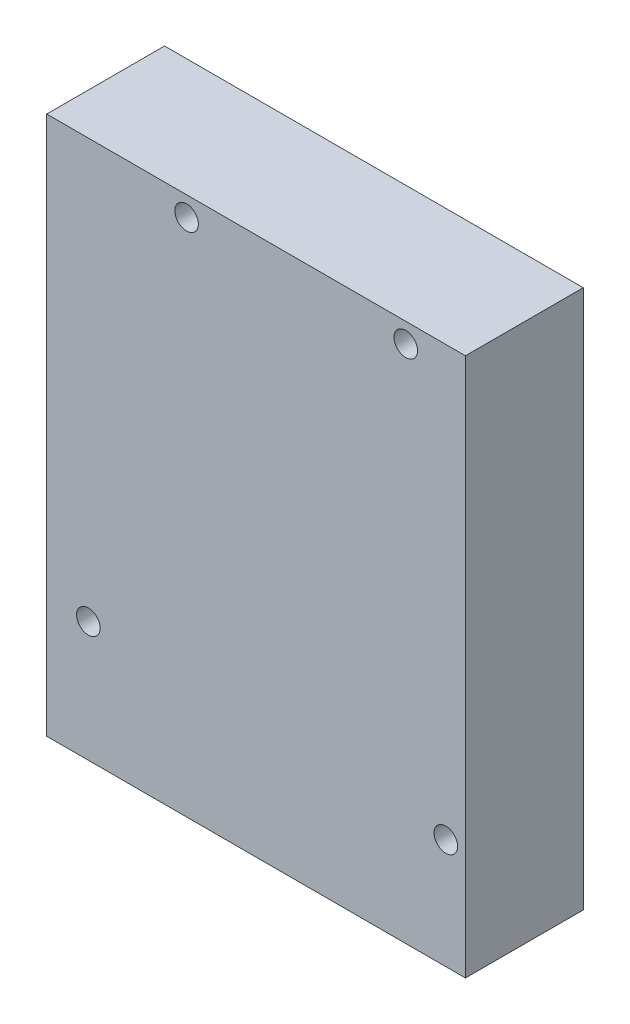
ISO-10303-21;
HEADER;
FILE_DESCRIPTION(('STEP AP214'),'2;1');
FILE_NAME('part.step','',(''),(''),'','','');
FILE_SCHEMA(('AUTOMOTIVE_DESIGN { 1 0 10303 214 1 1 1 1 }'));
ENDSEC;
DATA;
#1=APPLICATION_CONTEXT('core data for automotive mechanical design processes');
#2=APPLICATION_PROTOCOL_DEFINITION('international standard','automotive_design',2000,#1);
#3=PRODUCT_CONTEXT('',#1,'mechanical');
#4=PRODUCT('Part','Part','',(#3));
#5=PRODUCT_RELATED_PRODUCT_CATEGORY('part','',(#4));
#6=PRODUCT_DEFINITION_FORMATION('','',#4);
#7=PRODUCT_DEFINITION_CONTEXT('part definition',#1,'design');
#8=PRODUCT_DEFINITION('design','',#6,#7);
#9=PRODUCT_DEFINITION_SHAPE('','',#8);
#10=(LENGTH_UNIT() NAMED_UNIT(*) SI_UNIT(.MILLI.,.METRE.));
#11=(NAMED_UNIT(*) PLANE_ANGLE_UNIT() SI_UNIT($,.RADIAN.));
#12=(NAMED_UNIT(*) SI_UNIT($,.STERADIAN.) SOLID_ANGLE_UNIT());
#13=UNCERTAINTY_MEASURE_WITH_UNIT(LENGTH_MEASURE(1.E-05),#10,'distance_accuracy_value','');
#14=(GEOMETRIC_REPRESENTATION_CONTEXT(3) GLOBAL_UNCERTAINTY_ASSIGNED_CONTEXT((#13)) GLOBAL_UNIT_ASSIGNED_CONTEXT((#10,
#11,#12)) REPRESENTATION_CONTEXT('',''));
#15=CARTESIAN_POINT('',(0.,0.,0.));
#16=DIRECTION('',(0.,0.,1.));
#17=DIRECTION('',(1.,0.,0.));
#18=AXIS2_PLACEMENT_3D('',#15,#16,#17);
#19=CARTESIAN_POINT('',(0.,0.,15.));
#20=DIRECTION('',(0.,0.,1.));
#21=DIRECTION('',(1.,0.,0.));
#22=AXIS2_PLACEMENT_3D('',#19,#20,#21);
#23=PLANE('',#22);
#24=CARTESIAN_POINT('',(-32.490811044057,0.148070951768275,15.));
#25=DIRECTION('',(0.,0.,1.));
#26=DIRECTION('',(1.,0.,0.));
#27=AXIS2_PLACEMENT_3D('',#24,#25,#26);
#28=CIRCLE('',#27,1.5);
#29=CARTESIAN_POINT('',(-30.990811044057,0.148070951768275,15.));
#30=VERTEX_POINT('',#29);
#31=EDGE_CURVE('E142',#30,#30,#28,.T.);
#32=ORIENTED_EDGE('',*,*,#31,.F.);
#33=EDGE_LOOP('',(#32));
#34=FACE_BOUND('',#33,.T.);
#35=CARTESIAN_POINT('',(-19.990811044057,50.9480709517683,15.));
#36=DIRECTION('',(0.,0.,1.));
#37=DIRECTION('',(1.,0.,0.));
#38=AXIS2_PLACEMENT_3D('',#35,#36,#37);
#39=CIRCLE('',#38,1.5);
#40=CARTESIAN_POINT('',(-18.490811044057,50.9480709517683,15.));
#41=VERTEX_POINT('',#40);
#42=EDGE_CURVE('E112',#41,#41,#39,.T.);
#43=ORIENTED_EDGE('',*,*,#42,.F.);
#44=EDGE_LOOP('',(#43));
#45=FACE_BOUND('',#44,.T.);
#46=DIRECTION('',(0.,-1.,0.));
#47=VECTOR('',#46,1.);
#48=CARTESIAN_POINT('',(-37.790811044057,53.4480709517683,15.));
#49=LINE('',#48,#47);
#50=CARTESIAN_POINT('',(-37.790811044057,53.4480709517683,15.));
#51=VERTEX_POINT('',#50);
#52=CARTESIAN_POINT('',(-37.790811044057,-15.1519290482317,15.));
#53=VERTEX_POINT('',#52);
#54=EDGE_CURVE('E92',#51,#53,#49,.T.);
#55=ORIENTED_EDGE('',*,*,#54,.T.);
#56=DIRECTION('',(1.,0.,0.));
#57=VECTOR('',#56,1.);
#58=CARTESIAN_POINT('',(-37.790811044057,-15.1519290482317,15.));
#59=LINE('',#58,#57);
#60=CARTESIAN_POINT('',(15.509188955943,-15.1519290482317,15.));
#61=VERTEX_POINT('',#60);
#62=EDGE_CURVE('E87',#53,#61,#59,.T.);
#63=ORIENTED_EDGE('',*,*,#62,.T.);
#64=DIRECTION('',(0.,1.,0.));
#65=VECTOR('',#64,1.);
#66=CARTESIAN_POINT('',(15.509188955943,53.4480709517683,15.));
#67=LINE('',#66,#65);
#68=CARTESIAN_POINT('',(15.509188955943,53.4480709517683,15.));
#69=VERTEX_POINT('',#68);
#70=EDGE_CURVE('E90',#61,#69,#67,.T.);
#71=ORIENTED_EDGE('',*,*,#70,.T.);
#72=DIRECTION('',(-1.,0.,0.));
#73=VECTOR('',#72,1.);
#74=CARTESIAN_POINT('',(-37.790811044057,53.4480709517683,15.));
#75=LINE('',#74,#73);
#76=EDGE_CURVE('E57',#69,#51,#75,.T.);
#77=ORIENTED_EDGE('',*,*,#76,.T.);
#78=EDGE_LOOP('',(#55,#63,#71,#77));
#79=FACE_BOUND('',#78,.T.);
#80=CARTESIAN_POINT('',(7.909188955943,50.9480709517683,15.));
#81=DIRECTION('',(0.,0.,1.));
#82=DIRECTION('',(1.,0.,0.));
#83=AXIS2_PLACEMENT_3D('',#80,#81,#82);
#84=CIRCLE('',#83,1.5);
#85=CARTESIAN_POINT('',(9.409188955943,50.9480709517683,15.));
#86=VERTEX_POINT('',#85);
#87=EDGE_CURVE('E134',#86,#86,#84,.T.);
#88=ORIENTED_EDGE('',*,*,#87,.F.);
#89=EDGE_LOOP('',(#88));
#90=FACE_BOUND('',#89,.T.);
#91=CARTESIAN_POINT('',(13.009188955943,-1.15192904823173,15.));
#92=DIRECTION('',(0.,0.,1.));
#93=DIRECTION('',(1.,0.,0.));
#94=AXIS2_PLACEMENT_3D('',#91,#92,#93);
#95=CIRCLE('',#94,1.5);
#96=CARTESIAN_POINT('',(14.509188955943,-1.15192904823173,15.));
#97=VERTEX_POINT('',#96);
#98=EDGE_CURVE('E150',#97,#97,#95,.T.);
#99=ORIENTED_EDGE('',*,*,#98,.F.);
#100=EDGE_LOOP('',(#99));
#101=FACE_BOUND('',#100,.T.);
#102=ADVANCED_FACE('F39',(#34,#45,#79,#90,#101),#23,.T.);
#103=CARTESIAN_POINT('',(0.,0.,0.));
#104=DIRECTION('',(0.,0.,1.));
#105=DIRECTION('',(1.,0.,0.));
#106=AXIS2_PLACEMENT_3D('',#103,#104,#105);
#107=PLANE('',#106);
#108=DIRECTION('',(0.,-1.,0.));
#109=VECTOR('',#108,1.);
#110=CARTESIAN_POINT('',(-37.790811044057,53.4480709517683,0.));
#111=LINE('',#110,#109);
#112=CARTESIAN_POINT('',(-37.790811044057,53.4480709517683,0.));
#113=VERTEX_POINT('',#112);
#114=CARTESIAN_POINT('',(-37.790811044057,-15.1519290482317,0.));
#115=VERTEX_POINT('',#114);
#116=EDGE_CURVE('E108',#113,#115,#111,.T.);
#117=ORIENTED_EDGE('',*,*,#116,.F.);
#118=DIRECTION('',(-1.,0.,0.));
#119=VECTOR('',#118,1.);
#120=CARTESIAN_POINT('',(-37.790811044057,53.4480709517683,0.));
#121=LINE('',#120,#119);
#122=CARTESIAN_POINT('',(15.509188955943,53.4480709517683,0.));
#123=VERTEX_POINT('',#122);
#124=EDGE_CURVE('E80',#123,#113,#121,.T.);
#125=ORIENTED_EDGE('',*,*,#124,.F.);
#126=DIRECTION('',(0.,1.,0.));
#127=VECTOR('',#126,1.);
#128=CARTESIAN_POINT('',(15.509188955943,53.4480709517683,0.));
#129=LINE('',#128,#127);
#130=CARTESIAN_POINT('',(15.509188955943,-15.1519290482317,0.));
#131=VERTEX_POINT('',#130);
#132=EDGE_CURVE('E74',#131,#123,#129,.T.);
#133=ORIENTED_EDGE('',*,*,#132,.F.);
#134=DIRECTION('',(1.,0.,0.));
#135=VECTOR('',#134,1.);
#136=CARTESIAN_POINT('',(-37.790811044057,-15.1519290482317,0.));
#137=LINE('',#136,#135);
#138=EDGE_CURVE('E97',#115,#131,#137,.T.);
#139=ORIENTED_EDGE('',*,*,#138,.F.);
#140=EDGE_LOOP('',(#117,#125,#133,#139));
#141=FACE_BOUND('',#140,.T.);
#142=CARTESIAN_POINT('',(-19.990811044057,50.9480709517683,0.));
#143=DIRECTION('',(0.,0.,1.));
#144=DIRECTION('',(1.,0.,0.));
#145=AXIS2_PLACEMENT_3D('',#142,#143,#144);
#146=CIRCLE('',#145,1.5);
#147=CARTESIAN_POINT('',(-18.490811044057,50.9480709517683,0.));
#148=VERTEX_POINT('',#147);
#149=EDGE_CURVE('E130',#148,#148,#146,.T.);
#150=ORIENTED_EDGE('',*,*,#149,.T.);
#151=EDGE_LOOP('',(#150));
#152=FACE_BOUND('',#151,.T.);
#153=CARTESIAN_POINT('',(7.909188955943,50.9480709517683,0.));
#154=DIRECTION('',(0.,0.,1.));
#155=DIRECTION('',(1.,0.,0.));
#156=AXIS2_PLACEMENT_3D('',#153,#154,#155);
#157=CIRCLE('',#156,1.5);
#158=CARTESIAN_POINT('',(9.409188955943,50.9480709517683,0.));
#159=VERTEX_POINT('',#158);
#160=EDGE_CURVE('E138',#159,#159,#157,.T.);
#161=ORIENTED_EDGE('',*,*,#160,.T.);
#162=EDGE_LOOP('',(#161));
#163=FACE_BOUND('',#162,.T.);
#164=CARTESIAN_POINT('',(-32.490811044057,0.148070951768275,0.));
#165=DIRECTION('',(0.,0.,1.));
#166=DIRECTION('',(1.,0.,0.));
#167=AXIS2_PLACEMENT_3D('',#164,#165,#166);
#168=CIRCLE('',#167,1.5);
#169=CARTESIAN_POINT('',(-30.990811044057,0.148070951768275,0.));
#170=VERTEX_POINT('',#169);
#171=EDGE_CURVE('E146',#170,#170,#168,.T.);
#172=ORIENTED_EDGE('',*,*,#171,.T.);
#173=EDGE_LOOP('',(#172));
#174=FACE_BOUND('',#173,.T.);
#175=CARTESIAN_POINT('',(13.009188955943,-1.15192904823173,0.));
#176=DIRECTION('',(0.,0.,1.));
#177=DIRECTION('',(1.,0.,0.));
#178=AXIS2_PLACEMENT_3D('',#175,#176,#177);
#179=CIRCLE('',#178,1.5);
#180=CARTESIAN_POINT('',(14.509188955943,-1.15192904823173,0.));
#181=VERTEX_POINT('',#180);
#182=EDGE_CURVE('E154',#181,#181,#179,.T.);
#183=ORIENTED_EDGE('',*,*,#182,.T.);
#184=EDGE_LOOP('',(#183));
#185=FACE_BOUND('',#184,.T.);
#186=ADVANCED_FACE('F125',(#141,#152,#163,#174,#185),#107,.F.);
#187=CARTESIAN_POINT('',(-37.790811044057,53.4480709517683,15.));
#188=DIRECTION('',(1.,0.,0.));
#189=DIRECTION('',(0.,1.,0.));
#190=AXIS2_PLACEMENT_3D('',#187,#188,#189);
#191=PLANE('',#190);
#192=ORIENTED_EDGE('',*,*,#116,.T.);
#193=DIRECTION('',(0.,0.,-1.));
#194=VECTOR('',#193,1.);
#195=CARTESIAN_POINT('',(-37.790811044057,-15.1519290482317,15.));
#196=LINE('',#195,#194);
#197=EDGE_CURVE('E11',#53,#115,#196,.T.);
#198=ORIENTED_EDGE('',*,*,#197,.F.);
#199=ORIENTED_EDGE('',*,*,#54,.F.);
#200=DIRECTION('',(0.,0.,-1.));
#201=VECTOR('',#200,1.);
#202=CARTESIAN_POINT('',(-37.790811044057,53.4480709517683,15.));
#203=LINE('',#202,#201);
#204=EDGE_CURVE('E104',#51,#113,#203,.T.);
#205=ORIENTED_EDGE('',*,*,#204,.T.);
#206=EDGE_LOOP('',(#192,#198,#199,#205));
#207=FACE_BOUND('',#206,.T.);
#208=ADVANCED_FACE('F41',(#207),#191,.F.);
#209=CARTESIAN_POINT('',(-37.790811044057,-15.1519290482317,15.));
#210=DIRECTION('',(0.,1.,0.));
#211=DIRECTION('',(0.,0.,1.));
#212=AXIS2_PLACEMENT_3D('',#209,#210,#211);
#213=PLANE('',#212);
#214=ORIENTED_EDGE('',*,*,#138,.T.);
#215=DIRECTION('',(0.,0.,-1.));
#216=VECTOR('',#215,1.);
#217=CARTESIAN_POINT('',(15.509188955943,-15.1519290482317,15.));
#218=LINE('',#217,#216);
#219=EDGE_CURVE('E49',#61,#131,#218,.T.);
#220=ORIENTED_EDGE('',*,*,#219,.F.);
#221=ORIENTED_EDGE('',*,*,#62,.F.);
#222=ORIENTED_EDGE('',*,*,#197,.T.);
#223=EDGE_LOOP('',(#214,#220,#221,#222));
#224=FACE_BOUND('',#223,.T.);
#225=ADVANCED_FACE('F96',(#224),#213,.F.);
#226=CARTESIAN_POINT('',(15.509188955943,53.4480709517683,15.));
#227=DIRECTION('',(-1.,0.,0.));
#228=DIRECTION('',(0.,-1.,0.));
#229=AXIS2_PLACEMENT_3D('',#226,#227,#228);
#230=PLANE('',#229);
#231=ORIENTED_EDGE('',*,*,#132,.T.);
#232=DIRECTION('',(0.,0.,-1.));
#233=VECTOR('',#232,1.);
#234=CARTESIAN_POINT('',(15.509188955943,53.4480709517683,15.));
#235=LINE('',#234,#233);
#236=EDGE_CURVE('E99',#69,#123,#235,.T.);
#237=ORIENTED_EDGE('',*,*,#236,.F.);
#238=ORIENTED_EDGE('',*,*,#70,.F.);
#239=ORIENTED_EDGE('',*,*,#219,.T.);
#240=EDGE_LOOP('',(#231,#237,#238,#239));
#241=FACE_BOUND('',#240,.T.);
#242=ADVANCED_FACE('F100',(#241),#230,.F.);
#243=CARTESIAN_POINT('',(-37.790811044057,53.4480709517683,15.));
#244=DIRECTION('',(0.,-1.,0.));
#245=DIRECTION('',(0.,0.,-1.));
#246=AXIS2_PLACEMENT_3D('',#243,#244,#245);
#247=PLANE('',#246);
#248=ORIENTED_EDGE('',*,*,#124,.T.);
#249=ORIENTED_EDGE('',*,*,#204,.F.);
#250=ORIENTED_EDGE('',*,*,#76,.F.);
#251=ORIENTED_EDGE('',*,*,#236,.T.);
#252=EDGE_LOOP('',(#248,#249,#250,#251));
#253=FACE_BOUND('',#252,.T.);
#254=ADVANCED_FACE('F122',(#253),#247,.F.);
#255=CARTESIAN_POINT('',(-19.990811044057,50.9480709517683,15.));
#256=DIRECTION('',(0.,0.,-1.));
#257=DIRECTION('',(-1.,0.,0.));
#258=AXIS2_PLACEMENT_3D('',#255,#256,#257);
#259=CYLINDRICAL_SURFACE('',#258,1.5);
#260=ORIENTED_EDGE('',*,*,#42,.T.);
#261=EDGE_LOOP('',(#260));
#262=FACE_BOUND('',#261,.T.);
#263=ORIENTED_EDGE('',*,*,#149,.F.);
#264=EDGE_LOOP('',(#263));
#265=FACE_BOUND('',#264,.T.);
#266=ADVANCED_FACE('F175',(#262,#265),#259,.F.);
#267=CARTESIAN_POINT('',(7.909188955943,50.9480709517683,15.));
#268=DIRECTION('',(0.,0.,-1.));
#269=DIRECTION('',(-1.,0.,0.));
#270=AXIS2_PLACEMENT_3D('',#267,#268,#269);
#271=CYLINDRICAL_SURFACE('',#270,1.5);
#272=ORIENTED_EDGE('',*,*,#87,.T.);
#273=EDGE_LOOP('',(#272));
#274=FACE_BOUND('',#273,.T.);
#275=ORIENTED_EDGE('',*,*,#160,.F.);
#276=EDGE_LOOP('',(#275));
#277=FACE_BOUND('',#276,.T.);
#278=ADVANCED_FACE('F221',(#274,#277),#271,.F.);
#279=CARTESIAN_POINT('',(-32.490811044057,0.148070951768275,15.));
#280=DIRECTION('',(0.,0.,-1.));
#281=DIRECTION('',(-1.,0.,0.));
#282=AXIS2_PLACEMENT_3D('',#279,#280,#281);
#283=CYLINDRICAL_SURFACE('',#282,1.5);
#284=ORIENTED_EDGE('',*,*,#31,.T.);
#285=EDGE_LOOP('',(#284));
#286=FACE_BOUND('',#285,.T.);
#287=ORIENTED_EDGE('',*,*,#171,.F.);
#288=EDGE_LOOP('',(#287));
#289=FACE_BOUND('',#288,.T.);
#290=ADVANCED_FACE('F229',(#286,#289),#283,.F.);
#291=CARTESIAN_POINT('',(13.009188955943,-1.15192904823173,15.));
#292=DIRECTION('',(0.,0.,-1.));
#293=DIRECTION('',(-1.,0.,0.));
#294=AXIS2_PLACEMENT_3D('',#291,#292,#293);
#295=CYLINDRICAL_SURFACE('',#294,1.5);
#296=ORIENTED_EDGE('',*,*,#98,.T.);
#297=EDGE_LOOP('',(#296));
#298=FACE_BOUND('',#297,.T.);
#299=ORIENTED_EDGE('',*,*,#182,.F.);
#300=EDGE_LOOP('',(#299));
#301=FACE_BOUND('',#300,.T.);
#302=ADVANCED_FACE('F162',(#298,#301),#295,.F.);
#303=CLOSED_SHELL('',(#102,#186,#208,#225,#242,#254,#266,#278,#290,#302));
#304=MANIFOLD_SOLID_BREP('B2',#303);
#305=ADVANCED_BREP_SHAPE_REPRESENTATION('',(#18,#304),#14);
#306=SHAPE_DEFINITION_REPRESENTATION(#9,#305);
ENDSEC;
END-ISO-10303-21;
